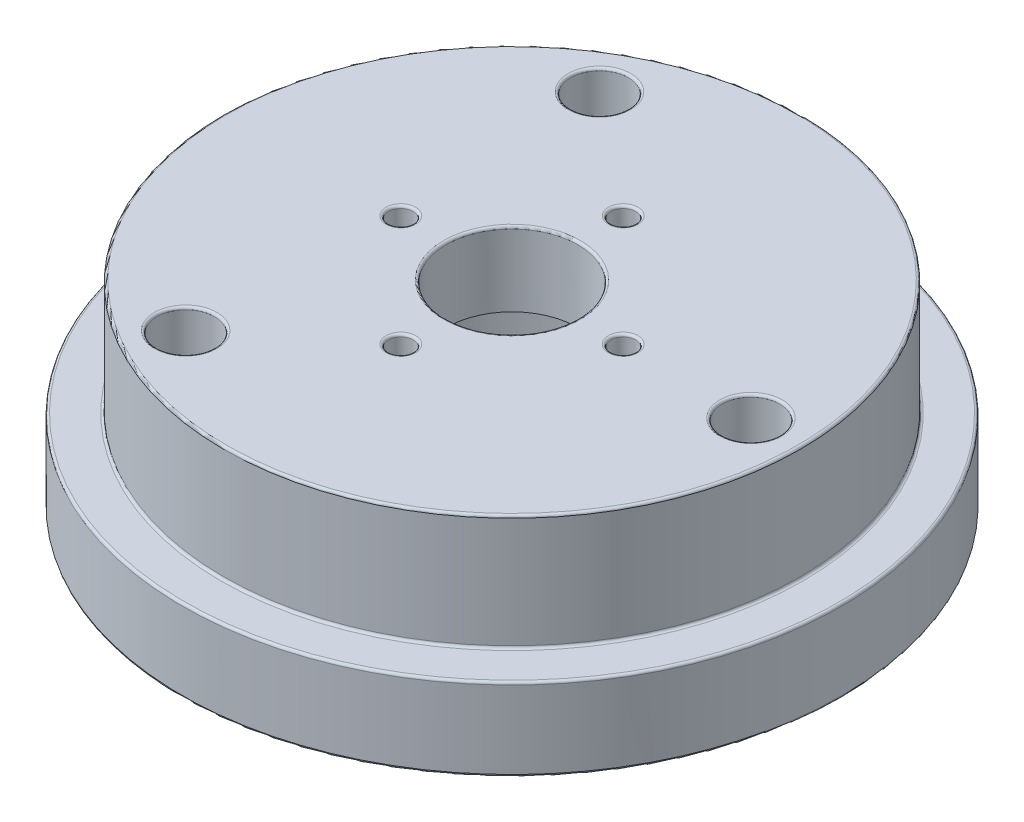
ISO-10303-21;
HEADER;
FILE_DESCRIPTION(('STEP AP214'),'2;1');
FILE_NAME('part.step','',(''),(''),'','','');
FILE_SCHEMA(('AUTOMOTIVE_DESIGN { 1 0 10303 214 1 1 1 1 }'));
ENDSEC;
DATA;
#1=APPLICATION_CONTEXT('core data for automotive mechanical design processes');
#2=APPLICATION_PROTOCOL_DEFINITION('international standard','automotive_design',2000,#1);
#3=PRODUCT_CONTEXT('',#1,'mechanical');
#4=PRODUCT('Part','Part','',(#3));
#5=PRODUCT_RELATED_PRODUCT_CATEGORY('part','',(#4));
#6=PRODUCT_DEFINITION_FORMATION('','',#4);
#7=PRODUCT_DEFINITION_CONTEXT('part definition',#1,'design');
#8=PRODUCT_DEFINITION('design','',#6,#7);
#9=PRODUCT_DEFINITION_SHAPE('','',#8);
#10=(LENGTH_UNIT() NAMED_UNIT(*) SI_UNIT(.MILLI.,.METRE.));
#11=(NAMED_UNIT(*) PLANE_ANGLE_UNIT() SI_UNIT($,.RADIAN.));
#12=(NAMED_UNIT(*) SI_UNIT($,.STERADIAN.) SOLID_ANGLE_UNIT());
#13=UNCERTAINTY_MEASURE_WITH_UNIT(LENGTH_MEASURE(1.E-05),#10,'distance_accuracy_value','');
#14=(GEOMETRIC_REPRESENTATION_CONTEXT(3) GLOBAL_UNCERTAINTY_ASSIGNED_CONTEXT((#13)) GLOBAL_UNIT_ASSIGNED_CONTEXT((#10,
#11,#12)) REPRESENTATION_CONTEXT('',''));
#15=CARTESIAN_POINT('',(0.,0.,0.));
#16=DIRECTION('',(0.,0.,1.));
#17=DIRECTION('',(1.,0.,0.));
#18=AXIS2_PLACEMENT_3D('',#15,#16,#17);
#19=CARTESIAN_POINT('',(-6.75,12.,0.));
#20=DIRECTION('',(0.,-1.,0.));
#21=DIRECTION('',(1.,0.,0.));
#22=AXIS2_PLACEMENT_3D('',#19,#20,#21);
#23=CYLINDRICAL_SURFACE('',#22,0.749999999999999);
#24=CARTESIAN_POINT('',(-6.75,11.85,0.));
#25=DIRECTION('',(0.,1.,0.));
#26=DIRECTION('',(-1.,0.,0.));
#27=AXIS2_PLACEMENT_3D('',#24,#25,#26);
#28=CIRCLE('',#27,0.749999999999999);
#29=CARTESIAN_POINT('',(-7.5,11.85,0.));
#30=VERTEX_POINT('',#29);
#31=EDGE_CURVE('E59',#30,#30,#28,.T.);
#32=ORIENTED_EDGE('',*,*,#31,.T.);
#33=EDGE_LOOP('',(#32));
#34=FACE_BOUND('',#33,.T.);
#35=CARTESIAN_POINT('',(-6.75,7.5,0.));
#36=DIRECTION('',(0.,-1.,0.));
#37=DIRECTION('',(1.,0.,0.));
#38=AXIS2_PLACEMENT_3D('',#35,#36,#37);
#39=CIRCLE('',#38,0.749999999999999);
#40=CARTESIAN_POINT('',(-6.,7.5,0.));
#41=VERTEX_POINT('',#40);
#42=EDGE_CURVE('E143',#41,#41,#39,.F.);
#43=ORIENTED_EDGE('',*,*,#42,.F.);
#44=EDGE_LOOP('',(#43));
#45=FACE_BOUND('',#44,.T.);
#46=ADVANCED_FACE('F39',(#34,#45),#23,.F.);
#47=CARTESIAN_POINT('',(0.,12.,0.));
#48=DIRECTION('',(0.,-1.,0.));
#49=DIRECTION('',(1.,0.,0.));
#50=AXIS2_PLACEMENT_3D('',#47,#48,#49);
#51=CYLINDRICAL_SURFACE('',#50,4.);
#52=CARTESIAN_POINT('',(0.,11.85,0.));
#53=DIRECTION('',(0.,1.,0.));
#54=DIRECTION('',(-1.,0.,0.));
#55=AXIS2_PLACEMENT_3D('',#52,#53,#54);
#56=CIRCLE('',#55,4.);
#57=CARTESIAN_POINT('',(-4.,11.85,0.));
#58=VERTEX_POINT('',#57);
#59=EDGE_CURVE('E54',#58,#58,#56,.T.);
#60=ORIENTED_EDGE('',*,*,#59,.T.);
#61=EDGE_LOOP('',(#60));
#62=FACE_BOUND('',#61,.T.);
#63=CARTESIAN_POINT('',(0.,7.5,0.));
#64=DIRECTION('',(0.,-1.,0.));
#65=DIRECTION('',(1.,0.,0.));
#66=AXIS2_PLACEMENT_3D('',#63,#64,#65);
#67=CIRCLE('',#66,4.);
#68=CARTESIAN_POINT('',(4.,7.5,0.));
#69=VERTEX_POINT('',#68);
#70=EDGE_CURVE('E151',#69,#69,#67,.F.);
#71=ORIENTED_EDGE('',*,*,#70,.F.);
#72=EDGE_LOOP('',(#71));
#73=FACE_BOUND('',#72,.T.);
#74=ADVANCED_FACE('F182',(#62,#73),#51,.F.);
#75=CARTESIAN_POINT('',(0.,12.,6.75));
#76=DIRECTION('',(0.,-1.,0.));
#77=DIRECTION('',(1.,0.,0.));
#78=AXIS2_PLACEMENT_3D('',#75,#76,#77);
#79=CYLINDRICAL_SURFACE('',#78,0.75);
#80=CARTESIAN_POINT('',(0.,11.85,6.75));
#81=DIRECTION('',(0.,1.,0.));
#82=DIRECTION('',(-1.,0.,0.));
#83=AXIS2_PLACEMENT_3D('',#80,#81,#82);
#84=CIRCLE('',#83,0.75);
#85=CARTESIAN_POINT('',(-0.75,11.85,6.75));
#86=VERTEX_POINT('',#85);
#87=EDGE_CURVE('E50',#86,#86,#84,.T.);
#88=ORIENTED_EDGE('',*,*,#87,.T.);
#89=EDGE_LOOP('',(#88));
#90=FACE_BOUND('',#89,.T.);
#91=CARTESIAN_POINT('',(0.,7.5,6.75));
#92=DIRECTION('',(0.,-1.,0.));
#93=DIRECTION('',(1.,0.,0.));
#94=AXIS2_PLACEMENT_3D('',#91,#92,#93);
#95=CIRCLE('',#94,0.75);
#96=CARTESIAN_POINT('',(0.75,7.5,6.75));
#97=VERTEX_POINT('',#96);
#98=EDGE_CURVE('E154',#97,#97,#95,.F.);
#99=ORIENTED_EDGE('',*,*,#98,.F.);
#100=EDGE_LOOP('',(#99));
#101=FACE_BOUND('',#100,.T.);
#102=ADVANCED_FACE('F188',(#90,#101),#79,.F.);
#103=CARTESIAN_POINT('',(0.,12.,-6.75));
#104=DIRECTION('',(0.,-1.,0.));
#105=DIRECTION('',(1.,0.,0.));
#106=AXIS2_PLACEMENT_3D('',#103,#104,#105);
#107=CYLINDRICAL_SURFACE('',#106,0.75);
#108=CARTESIAN_POINT('',(0.,11.85,-6.75));
#109=DIRECTION('',(0.,1.,0.));
#110=DIRECTION('',(-1.,0.,0.));
#111=AXIS2_PLACEMENT_3D('',#108,#109,#110);
#112=CIRCLE('',#111,0.75);
#113=CARTESIAN_POINT('',(-0.749999999999998,11.85,-6.75));
#114=VERTEX_POINT('',#113);
#115=EDGE_CURVE('E46',#114,#114,#112,.T.);
#116=ORIENTED_EDGE('',*,*,#115,.T.);
#117=EDGE_LOOP('',(#116));
#118=FACE_BOUND('',#117,.T.);
#119=CARTESIAN_POINT('',(0.,7.5,-6.75));
#120=DIRECTION('',(0.,-1.,0.));
#121=DIRECTION('',(1.,0.,0.));
#122=AXIS2_PLACEMENT_3D('',#119,#120,#121);
#123=CIRCLE('',#122,0.75);
#124=CARTESIAN_POINT('',(0.750000000000002,7.5,-6.75));
#125=VERTEX_POINT('',#124);
#126=EDGE_CURVE('E147',#125,#125,#123,.F.);
#127=ORIENTED_EDGE('',*,*,#126,.F.);
#128=EDGE_LOOP('',(#127));
#129=FACE_BOUND('',#128,.T.);
#130=ADVANCED_FACE('F296',(#118,#129),#107,.F.);
#131=CARTESIAN_POINT('',(6.75,12.,0.));
#132=DIRECTION('',(0.,-1.,0.));
#133=DIRECTION('',(1.,0.,0.));
#134=AXIS2_PLACEMENT_3D('',#131,#132,#133);
#135=CYLINDRICAL_SURFACE('',#134,0.749999999999999);
#136=CARTESIAN_POINT('',(6.75,11.85,0.));
#137=DIRECTION('',(0.,1.,0.));
#138=DIRECTION('',(-1.,0.,0.));
#139=AXIS2_PLACEMENT_3D('',#136,#137,#138);
#140=CIRCLE('',#139,0.749999999999999);
#141=CARTESIAN_POINT('',(6.,11.85,0.));
#142=VERTEX_POINT('',#141);
#143=EDGE_CURVE('E10',#142,#142,#140,.T.);
#144=ORIENTED_EDGE('',*,*,#143,.T.);
#145=EDGE_LOOP('',(#144));
#146=FACE_BOUND('',#145,.T.);
#147=CARTESIAN_POINT('',(6.75,7.5,0.));
#148=DIRECTION('',(0.,-1.,0.));
#149=DIRECTION('',(1.,0.,0.));
#150=AXIS2_PLACEMENT_3D('',#147,#148,#149);
#151=CIRCLE('',#150,0.749999999999999);
#152=CARTESIAN_POINT('',(7.5,7.5,0.));
#153=VERTEX_POINT('',#152);
#154=EDGE_CURVE('E144',#153,#153,#151,.F.);
#155=ORIENTED_EDGE('',*,*,#154,.F.);
#156=EDGE_LOOP('',(#155));
#157=FACE_BOUND('',#156,.T.);
#158=ADVANCED_FACE('F220',(#146,#157),#135,.F.);
#159=CARTESIAN_POINT('',(0.,0.,0.));
#160=DIRECTION('',(0.,-1.,0.));
#161=DIRECTION('',(1.,0.,0.));
#162=AXIS2_PLACEMENT_3D('',#159,#160,#161);
#163=PLANE('',#162);
#164=CARTESIAN_POINT('',(0.,0.,0.));
#165=DIRECTION('',(0.,-1.,0.));
#166=DIRECTION('',(1.,0.,0.));
#167=AXIS2_PLACEMENT_3D('',#164,#165,#166);
#168=CIRCLE('',#167,19.85);
#169=CARTESIAN_POINT('',(19.85,0.,0.));
#170=VERTEX_POINT('',#169);
#171=EDGE_CURVE('E122',#170,#170,#168,.T.);
#172=ORIENTED_EDGE('',*,*,#171,.T.);
#173=EDGE_LOOP('',(#172));
#174=FACE_BOUND('',#173,.T.);
#175=CARTESIAN_POINT('',(14.5,0.,0.));
#176=DIRECTION('',(0.,-1.,0.));
#177=DIRECTION('',(1.,0.,0.));
#178=AXIS2_PLACEMENT_3D('',#175,#176,#177);
#179=CIRCLE('',#178,1.9);
#180=CARTESIAN_POINT('',(16.4,0.,0.));
#181=VERTEX_POINT('',#180);
#182=EDGE_CURVE('E125',#181,#181,#179,.F.);
#183=ORIENTED_EDGE('',*,*,#182,.T.);
#184=EDGE_LOOP('',(#183));
#185=FACE_BOUND('',#184,.T.);
#186=CARTESIAN_POINT('',(-7.25000000000006,0.,-12.5573683548743));
#187=DIRECTION('',(0.,-1.,0.));
#188=DIRECTION('',(1.,0.,0.));
#189=AXIS2_PLACEMENT_3D('',#186,#187,#188);
#190=CIRCLE('',#189,1.9);
#191=CARTESIAN_POINT('',(-5.35000000000006,0.,-12.5573683548743));
#192=VERTEX_POINT('',#191);
#193=EDGE_CURVE('E128',#192,#192,#190,.F.);
#194=ORIENTED_EDGE('',*,*,#193,.T.);
#195=EDGE_LOOP('',(#194));
#196=FACE_BOUND('',#195,.T.);
#197=CARTESIAN_POINT('',(-7.24999999999988,0.,12.5573683548744));
#198=DIRECTION('',(0.,-1.,0.));
#199=DIRECTION('',(1.,0.,0.));
#200=AXIS2_PLACEMENT_3D('',#197,#198,#199);
#201=CIRCLE('',#200,1.9);
#202=CARTESIAN_POINT('',(-5.34999999999988,0.,12.5573683548744));
#203=VERTEX_POINT('',#202);
#204=EDGE_CURVE('E131',#203,#203,#201,.F.);
#205=ORIENTED_EDGE('',*,*,#204,.T.);
#206=EDGE_LOOP('',(#205));
#207=FACE_BOUND('',#206,.T.);
#208=CARTESIAN_POINT('',(0.,0.,0.));
#209=DIRECTION('',(0.,-1.,0.));
#210=DIRECTION('',(1.,0.,0.));
#211=AXIS2_PLACEMENT_3D('',#208,#209,#210);
#212=CIRCLE('',#211,10.15);
#213=CARTESIAN_POINT('',(10.15,0.,0.));
#214=VERTEX_POINT('',#213);
#215=EDGE_CURVE('E134',#214,#214,#212,.F.);
#216=ORIENTED_EDGE('',*,*,#215,.T.);
#217=EDGE_LOOP('',(#216));
#218=FACE_BOUND('',#217,.T.);
#219=ADVANCED_FACE('F217',(#174,#185,#196,#207,#218),#163,.T.);
#220=CARTESIAN_POINT('',(0.,12.,0.));
#221=DIRECTION('',(0.,1.,0.));
#222=DIRECTION('',(-1.,0.,0.));
#223=AXIS2_PLACEMENT_3D('',#220,#221,#222);
#224=CYLINDRICAL_SURFACE('',#223,20.);
#225=CARTESIAN_POINT('',(0.,0.149999999999999,0.));
#226=DIRECTION('',(0.,-1.,0.));
#227=DIRECTION('',(1.,0.,0.));
#228=AXIS2_PLACEMENT_3D('',#225,#226,#227);
#229=CIRCLE('',#228,20.);
#230=CARTESIAN_POINT('',(20.,0.149999999999999,0.));
#231=VERTEX_POINT('',#230);
#232=EDGE_CURVE('E137',#231,#231,#229,.F.);
#233=ORIENTED_EDGE('',*,*,#232,.T.);
#234=EDGE_LOOP('',(#233));
#235=FACE_BOUND('',#234,.T.);
#236=CARTESIAN_POINT('',(0.,4.85,0.));
#237=DIRECTION('',(0.,1.,0.));
#238=DIRECTION('',(-1.,0.,0.));
#239=AXIS2_PLACEMENT_3D('',#236,#237,#238);
#240=CIRCLE('',#239,20.);
#241=CARTESIAN_POINT('',(-20.,4.85,0.));
#242=VERTEX_POINT('',#241);
#243=EDGE_CURVE('E140',#242,#242,#240,.F.);
#244=ORIENTED_EDGE('',*,*,#243,.T.);
#245=EDGE_LOOP('',(#244));
#246=FACE_BOUND('',#245,.T.);
#247=ADVANCED_FACE('F213',(#235,#246),#224,.T.);
#248=CARTESIAN_POINT('',(-20.,5.,0.));
#249=DIRECTION('',(0.,1.,0.));
#250=DIRECTION('',(-1.,0.,0.));
#251=AXIS2_PLACEMENT_3D('',#248,#249,#250);
#252=PLANE('',#251);
#253=CARTESIAN_POINT('',(0.,5.,0.));
#254=DIRECTION('',(0.,1.,0.));
#255=DIRECTION('',(-1.,0.,0.));
#256=AXIS2_PLACEMENT_3D('',#253,#254,#255);
#257=CIRCLE('',#256,17.65);
#258=CARTESIAN_POINT('',(-17.65,5.,0.));
#259=VERTEX_POINT('',#258);
#260=EDGE_CURVE('E89',#259,#259,#257,.F.);
#261=ORIENTED_EDGE('',*,*,#260,.T.);
#262=EDGE_LOOP('',(#261));
#263=FACE_BOUND('',#262,.T.);
#264=CARTESIAN_POINT('',(0.,5.,0.));
#265=DIRECTION('',(0.,1.,0.));
#266=DIRECTION('',(-1.,0.,0.));
#267=AXIS2_PLACEMENT_3D('',#264,#265,#266);
#268=CIRCLE('',#267,19.85);
#269=CARTESIAN_POINT('',(-19.85,5.,0.));
#270=VERTEX_POINT('',#269);
#271=EDGE_CURVE('E92',#270,#270,#268,.T.);
#272=ORIENTED_EDGE('',*,*,#271,.T.);
#273=EDGE_LOOP('',(#272));
#274=FACE_BOUND('',#273,.T.);
#275=ADVANCED_FACE('F209',(#263,#274),#252,.T.);
#276=CARTESIAN_POINT('',(0.,12.,0.));
#277=DIRECTION('',(0.,1.,0.));
#278=DIRECTION('',(-1.,0.,0.));
#279=AXIS2_PLACEMENT_3D('',#276,#277,#278);
#280=CYLINDRICAL_SURFACE('',#279,17.5);
#281=CARTESIAN_POINT('',(0.,5.15,0.));
#282=DIRECTION('',(0.,1.,0.));
#283=DIRECTION('',(-1.,0.,0.));
#284=AXIS2_PLACEMENT_3D('',#281,#282,#283);
#285=CIRCLE('',#284,17.5);
#286=CARTESIAN_POINT('',(-17.5,5.15,0.));
#287=VERTEX_POINT('',#286);
#288=EDGE_CURVE('E95',#287,#287,#285,.T.);
#289=ORIENTED_EDGE('',*,*,#288,.T.);
#290=EDGE_LOOP('',(#289));
#291=FACE_BOUND('',#290,.T.);
#292=CARTESIAN_POINT('',(0.,11.85,0.));
#293=DIRECTION('',(0.,1.,0.));
#294=DIRECTION('',(-1.,0.,0.));
#295=AXIS2_PLACEMENT_3D('',#292,#293,#294);
#296=CIRCLE('',#295,17.5);
#297=CARTESIAN_POINT('',(-17.5,11.85,0.));
#298=VERTEX_POINT('',#297);
#299=EDGE_CURVE('E98',#298,#298,#296,.F.);
#300=ORIENTED_EDGE('',*,*,#299,.T.);
#301=EDGE_LOOP('',(#300));
#302=FACE_BOUND('',#301,.T.);
#303=ADVANCED_FACE('F205',(#291,#302),#280,.T.);
#304=CARTESIAN_POINT('',(-17.5,12.,0.));
#305=DIRECTION('',(0.,1.,0.));
#306=DIRECTION('',(-1.,0.,0.));
#307=AXIS2_PLACEMENT_3D('',#304,#305,#306);
#308=PLANE('',#307);
#309=CARTESIAN_POINT('',(0.,12.,0.));
#310=DIRECTION('',(0.,1.,0.));
#311=DIRECTION('',(-1.,0.,0.));
#312=AXIS2_PLACEMENT_3D('',#309,#310,#311);
#313=CIRCLE('',#312,17.35);
#314=CARTESIAN_POINT('',(-17.35,12.,0.));
#315=VERTEX_POINT('',#314);
#316=EDGE_CURVE('E62',#315,#315,#313,.T.);
#317=ORIENTED_EDGE('',*,*,#316,.T.);
#318=EDGE_LOOP('',(#317));
#319=FACE_BOUND('',#318,.T.);
#320=CARTESIAN_POINT('',(-6.75,12.,0.));
#321=DIRECTION('',(0.,1.,0.));
#322=DIRECTION('',(-1.,0.,0.));
#323=AXIS2_PLACEMENT_3D('',#320,#321,#322);
#324=CIRCLE('',#323,0.899999999999999);
#325=CARTESIAN_POINT('',(-7.65,12.,0.));
#326=VERTEX_POINT('',#325);
#327=EDGE_CURVE('E65',#326,#326,#324,.F.);
#328=ORIENTED_EDGE('',*,*,#327,.T.);
#329=EDGE_LOOP('',(#328));
#330=FACE_BOUND('',#329,.T.);
#331=CARTESIAN_POINT('',(0.,12.,0.));
#332=DIRECTION('',(0.,1.,0.));
#333=DIRECTION('',(-1.,0.,0.));
#334=AXIS2_PLACEMENT_3D('',#331,#332,#333);
#335=CIRCLE('',#334,4.15);
#336=CARTESIAN_POINT('',(-4.15,12.,0.));
#337=VERTEX_POINT('',#336);
#338=EDGE_CURVE('E68',#337,#337,#335,.F.);
#339=ORIENTED_EDGE('',*,*,#338,.T.);
#340=EDGE_LOOP('',(#339));
#341=FACE_BOUND('',#340,.T.);
#342=CARTESIAN_POINT('',(14.5,12.,0.));
#343=DIRECTION('',(0.,1.,0.));
#344=DIRECTION('',(-1.,0.,0.));
#345=AXIS2_PLACEMENT_3D('',#342,#343,#344);
#346=CIRCLE('',#345,1.9);
#347=CARTESIAN_POINT('',(12.6,12.,0.));
#348=VERTEX_POINT('',#347);
#349=EDGE_CURVE('E71',#348,#348,#346,.F.);
#350=ORIENTED_EDGE('',*,*,#349,.T.);
#351=EDGE_LOOP('',(#350));
#352=FACE_BOUND('',#351,.T.);
#353=CARTESIAN_POINT('',(-7.25000000000006,12.,-12.5573683548743));
#354=DIRECTION('',(0.,1.,0.));
#355=DIRECTION('',(-1.,0.,0.));
#356=AXIS2_PLACEMENT_3D('',#353,#354,#355);
#357=CIRCLE('',#356,1.9);
#358=CARTESIAN_POINT('',(-9.15000000000006,12.,-12.5573683548743));
#359=VERTEX_POINT('',#358);
#360=EDGE_CURVE('E74',#359,#359,#357,.F.);
#361=ORIENTED_EDGE('',*,*,#360,.T.);
#362=EDGE_LOOP('',(#361));
#363=FACE_BOUND('',#362,.T.);
#364=CARTESIAN_POINT('',(0.,12.,6.75));
#365=DIRECTION('',(0.,1.,0.));
#366=DIRECTION('',(-1.,0.,0.));
#367=AXIS2_PLACEMENT_3D('',#364,#365,#366);
#368=CIRCLE('',#367,0.9);
#369=CARTESIAN_POINT('',(-0.9,12.,6.75));
#370=VERTEX_POINT('',#369);
#371=EDGE_CURVE('E77',#370,#370,#368,.F.);
#372=ORIENTED_EDGE('',*,*,#371,.T.);
#373=EDGE_LOOP('',(#372));
#374=FACE_BOUND('',#373,.T.);
#375=CARTESIAN_POINT('',(0.,12.,-6.75));
#376=DIRECTION('',(0.,1.,0.));
#377=DIRECTION('',(-1.,0.,0.));
#378=AXIS2_PLACEMENT_3D('',#375,#376,#377);
#379=CIRCLE('',#378,0.9);
#380=CARTESIAN_POINT('',(-0.899999999999998,12.,-6.75));
#381=VERTEX_POINT('',#380);
#382=EDGE_CURVE('E80',#381,#381,#379,.F.);
#383=ORIENTED_EDGE('',*,*,#382,.T.);
#384=EDGE_LOOP('',(#383));
#385=FACE_BOUND('',#384,.T.);
#386=CARTESIAN_POINT('',(6.75,12.,0.));
#387=DIRECTION('',(0.,1.,0.));
#388=DIRECTION('',(-1.,0.,0.));
#389=AXIS2_PLACEMENT_3D('',#386,#387,#388);
#390=CIRCLE('',#389,0.899999999999999);
#391=CARTESIAN_POINT('',(5.85,12.,0.));
#392=VERTEX_POINT('',#391);
#393=EDGE_CURVE('E83',#392,#392,#390,.F.);
#394=ORIENTED_EDGE('',*,*,#393,.T.);
#395=EDGE_LOOP('',(#394));
#396=FACE_BOUND('',#395,.T.);
#397=CARTESIAN_POINT('',(-7.24999999999988,12.,12.5573683548744));
#398=DIRECTION('',(0.,1.,0.));
#399=DIRECTION('',(-1.,0.,0.));
#400=AXIS2_PLACEMENT_3D('',#397,#398,#399);
#401=CIRCLE('',#400,1.9);
#402=CARTESIAN_POINT('',(-9.14999999999988,12.,12.5573683548744));
#403=VERTEX_POINT('',#402);
#404=EDGE_CURVE('E86',#403,#403,#401,.F.);
#405=ORIENTED_EDGE('',*,*,#404,.T.);
#406=EDGE_LOOP('',(#405));
#407=FACE_BOUND('',#406,.T.);
#408=ADVANCED_FACE('F201',(#319,#330,#341,#352,#363,#374,#385,#396,#407),#308,.T.);
#409=CARTESIAN_POINT('',(14.5,12.,0.));
#410=DIRECTION('',(0.,-1.,0.));
#411=DIRECTION('',(1.,0.,0.));
#412=AXIS2_PLACEMENT_3D('',#409,#410,#411);
#413=CYLINDRICAL_SURFACE('',#412,1.75);
#414=CARTESIAN_POINT('',(14.5,0.149999999999999,0.));
#415=DIRECTION('',(0.,-1.,0.));
#416=DIRECTION('',(1.,0.,0.));
#417=AXIS2_PLACEMENT_3D('',#414,#415,#416);
#418=CIRCLE('',#417,1.75);
#419=CARTESIAN_POINT('',(16.25,0.149999999999999,0.));
#420=VERTEX_POINT('',#419);
#421=EDGE_CURVE('E116',#420,#420,#418,.T.);
#422=ORIENTED_EDGE('',*,*,#421,.T.);
#423=EDGE_LOOP('',(#422));
#424=FACE_BOUND('',#423,.T.);
#425=CARTESIAN_POINT('',(14.5,11.85,0.));
#426=DIRECTION('',(0.,1.,0.));
#427=DIRECTION('',(-1.,0.,0.));
#428=AXIS2_PLACEMENT_3D('',#425,#426,#427);
#429=CIRCLE('',#428,1.75);
#430=CARTESIAN_POINT('',(12.75,11.85,0.));
#431=VERTEX_POINT('',#430);
#432=EDGE_CURVE('E119',#431,#431,#429,.T.);
#433=ORIENTED_EDGE('',*,*,#432,.T.);
#434=EDGE_LOOP('',(#433));
#435=FACE_BOUND('',#434,.T.);
#436=ADVANCED_FACE('F197',(#424,#435),#413,.F.);
#437=CARTESIAN_POINT('',(-7.25000000000006,12.,-12.5573683548743));
#438=DIRECTION('',(0.,-1.,0.));
#439=DIRECTION('',(1.,0.,0.));
#440=AXIS2_PLACEMENT_3D('',#437,#438,#439);
#441=CYLINDRICAL_SURFACE('',#440,1.75);
#442=CARTESIAN_POINT('',(-7.25000000000006,0.149999999999999,-12.5573683548743));
#443=DIRECTION('',(0.,-1.,0.));
#444=DIRECTION('',(1.,0.,0.));
#445=AXIS2_PLACEMENT_3D('',#442,#443,#444);
#446=CIRCLE('',#445,1.75);
#447=CARTESIAN_POINT('',(-5.50000000000006,0.149999999999999,-12.5573683548743));
#448=VERTEX_POINT('',#447);
#449=EDGE_CURVE('E110',#448,#448,#446,.T.);
#450=ORIENTED_EDGE('',*,*,#449,.T.);
#451=EDGE_LOOP('',(#450));
#452=FACE_BOUND('',#451,.T.);
#453=CARTESIAN_POINT('',(-7.25000000000006,11.85,-12.5573683548743));
#454=DIRECTION('',(0.,1.,0.));
#455=DIRECTION('',(-1.,0.,0.));
#456=AXIS2_PLACEMENT_3D('',#453,#454,#455);
#457=CIRCLE('',#456,1.75);
#458=CARTESIAN_POINT('',(-9.00000000000006,11.85,-12.5573683548743));
#459=VERTEX_POINT('',#458);
#460=EDGE_CURVE('E113',#459,#459,#457,.T.);
#461=ORIENTED_EDGE('',*,*,#460,.T.);
#462=EDGE_LOOP('',(#461));
#463=FACE_BOUND('',#462,.T.);
#464=ADVANCED_FACE('F194',(#452,#463),#441,.F.);
#465=CARTESIAN_POINT('',(-7.24999999999988,12.,12.5573683548744));
#466=DIRECTION('',(0.,-1.,0.));
#467=DIRECTION('',(1.,0.,0.));
#468=AXIS2_PLACEMENT_3D('',#465,#466,#467);
#469=CYLINDRICAL_SURFACE('',#468,1.75);
#470=CARTESIAN_POINT('',(-7.24999999999988,0.149999999999999,12.5573683548744));
#471=DIRECTION('',(0.,-1.,0.));
#472=DIRECTION('',(1.,0.,0.));
#473=AXIS2_PLACEMENT_3D('',#470,#471,#472);
#474=CIRCLE('',#473,1.75);
#475=CARTESIAN_POINT('',(-5.49999999999988,0.149999999999999,12.5573683548744));
#476=VERTEX_POINT('',#475);
#477=EDGE_CURVE('E104',#476,#476,#474,.T.);
#478=ORIENTED_EDGE('',*,*,#477,.T.);
#479=EDGE_LOOP('',(#478));
#480=FACE_BOUND('',#479,.T.);
#481=CARTESIAN_POINT('',(-7.24999999999988,11.85,12.5573683548744));
#482=DIRECTION('',(0.,1.,0.));
#483=DIRECTION('',(-1.,0.,0.));
#484=AXIS2_PLACEMENT_3D('',#481,#482,#483);
#485=CIRCLE('',#484,1.75);
#486=CARTESIAN_POINT('',(-8.99999999999988,11.85,12.5573683548744));
#487=VERTEX_POINT('',#486);
#488=EDGE_CURVE('E107',#487,#487,#485,.T.);
#489=ORIENTED_EDGE('',*,*,#488,.T.);
#490=EDGE_LOOP('',(#489));
#491=FACE_BOUND('',#490,.T.);
#492=ADVANCED_FACE('F178',(#480,#491),#469,.F.);
#493=CARTESIAN_POINT('',(0.,7.5,0.));
#494=DIRECTION('',(0.,-1.,0.));
#495=DIRECTION('',(1.,0.,0.));
#496=AXIS2_PLACEMENT_3D('',#493,#494,#495);
#497=PLANE('',#496);
#498=CARTESIAN_POINT('',(0.,7.5,0.));
#499=DIRECTION('',(0.,-1.,0.));
#500=DIRECTION('',(1.,0.,0.));
#501=AXIS2_PLACEMENT_3D('',#498,#499,#500);
#502=CIRCLE('',#501,10.);
#503=CARTESIAN_POINT('',(10.,7.5,0.));
#504=VERTEX_POINT('',#503);
#505=EDGE_CURVE('E148',#504,#504,#502,.T.);
#506=ORIENTED_EDGE('',*,*,#505,.T.);
#507=EDGE_LOOP('',(#506));
#508=FACE_BOUND('',#507,.T.);
#509=ORIENTED_EDGE('',*,*,#154,.T.);
#510=EDGE_LOOP('',(#509));
#511=FACE_BOUND('',#510,.T.);
#512=ORIENTED_EDGE('',*,*,#126,.T.);
#513=EDGE_LOOP('',(#512));
#514=FACE_BOUND('',#513,.T.);
#515=ORIENTED_EDGE('',*,*,#98,.T.);
#516=EDGE_LOOP('',(#515));
#517=FACE_BOUND('',#516,.T.);
#518=ORIENTED_EDGE('',*,*,#70,.T.);
#519=EDGE_LOOP('',(#518));
#520=FACE_BOUND('',#519,.T.);
#521=ORIENTED_EDGE('',*,*,#42,.T.);
#522=EDGE_LOOP('',(#521));
#523=FACE_BOUND('',#522,.T.);
#524=ADVANCED_FACE('F162',(#508,#511,#514,#517,#520,#523),#497,.T.);
#525=CARTESIAN_POINT('',(0.,7.5,0.));
#526=DIRECTION('',(0.,-1.,0.));
#527=DIRECTION('',(1.,0.,0.));
#528=AXIS2_PLACEMENT_3D('',#525,#526,#527);
#529=CYLINDRICAL_SURFACE('',#528,10.);
#530=CARTESIAN_POINT('',(0.,0.15,0.));
#531=DIRECTION('',(0.,-1.,0.));
#532=DIRECTION('',(1.,0.,0.));
#533=AXIS2_PLACEMENT_3D('',#530,#531,#532);
#534=CIRCLE('',#533,10.);
#535=CARTESIAN_POINT('',(10.,0.15,0.));
#536=VERTEX_POINT('',#535);
#537=EDGE_CURVE('E101',#536,#536,#534,.T.);
#538=ORIENTED_EDGE('',*,*,#537,.T.);
#539=EDGE_LOOP('',(#538));
#540=FACE_BOUND('',#539,.T.);
#541=ORIENTED_EDGE('',*,*,#505,.F.);
#542=EDGE_LOOP('',(#541));
#543=FACE_BOUND('',#542,.T.);
#544=ADVANCED_FACE('F165',(#540,#543),#529,.F.);
#545=CARTESIAN_POINT('',(0.,0.149999999999999,0.));
#546=DIRECTION('',(0.,-1.,0.));
#547=DIRECTION('',(1.,0.,0.));
#548=AXIS2_PLACEMENT_3D('',#545,#546,#547);
#549=TOROIDAL_SURFACE('',#548,19.85,0.15);
#550=ORIENTED_EDGE('',*,*,#171,.F.);
#551=EDGE_LOOP('',(#550));
#552=FACE_BOUND('',#551,.T.);
#553=ORIENTED_EDGE('',*,*,#232,.F.);
#554=EDGE_LOOP('',(#553));
#555=FACE_BOUND('',#554,.T.);
#556=ADVANCED_FACE('F167',(#552,#555),#549,.T.);
#557=CARTESIAN_POINT('',(14.5,0.149999999999999,0.));
#558=DIRECTION('',(0.,-1.,0.));
#559=DIRECTION('',(1.,0.,0.));
#560=AXIS2_PLACEMENT_3D('',#557,#558,#559);
#561=TOROIDAL_SURFACE('',#560,1.9,0.15);
#562=ORIENTED_EDGE('',*,*,#182,.F.);
#563=EDGE_LOOP('',(#562));
#564=FACE_BOUND('',#563,.T.);
#565=ORIENTED_EDGE('',*,*,#421,.F.);
#566=EDGE_LOOP('',(#565));
#567=FACE_BOUND('',#566,.T.);
#568=ADVANCED_FACE('F174',(#564,#567),#561,.T.);
#569=CARTESIAN_POINT('',(-7.25000000000006,0.149999999999999,-12.5573683548743));
#570=DIRECTION('',(0.,-1.,0.));
#571=DIRECTION('',(1.,0.,0.));
#572=AXIS2_PLACEMENT_3D('',#569,#570,#571);
#573=TOROIDAL_SURFACE('',#572,1.9,0.15);
#574=ORIENTED_EDGE('',*,*,#193,.F.);
#575=EDGE_LOOP('',(#574));
#576=FACE_BOUND('',#575,.T.);
#577=ORIENTED_EDGE('',*,*,#449,.F.);
#578=EDGE_LOOP('',(#577));
#579=FACE_BOUND('',#578,.T.);
#580=ADVANCED_FACE('F225',(#576,#579),#573,.T.);
#581=CARTESIAN_POINT('',(-7.24999999999988,0.149999999999999,12.5573683548744));
#582=DIRECTION('',(0.,-1.,0.));
#583=DIRECTION('',(1.,0.,0.));
#584=AXIS2_PLACEMENT_3D('',#581,#582,#583);
#585=TOROIDAL_SURFACE('',#584,1.9,0.15);
#586=ORIENTED_EDGE('',*,*,#204,.F.);
#587=EDGE_LOOP('',(#586));
#588=FACE_BOUND('',#587,.T.);
#589=ORIENTED_EDGE('',*,*,#477,.F.);
#590=EDGE_LOOP('',(#589));
#591=FACE_BOUND('',#590,.T.);
#592=ADVANCED_FACE('F229',(#588,#591),#585,.T.);
#593=CARTESIAN_POINT('',(0.,0.15,0.));
#594=DIRECTION('',(0.,-1.,0.));
#595=DIRECTION('',(1.,0.,0.));
#596=AXIS2_PLACEMENT_3D('',#593,#594,#595);
#597=TOROIDAL_SURFACE('',#596,10.15,0.15);
#598=ORIENTED_EDGE('',*,*,#215,.F.);
#599=EDGE_LOOP('',(#598));
#600=FACE_BOUND('',#599,.T.);
#601=ORIENTED_EDGE('',*,*,#537,.F.);
#602=EDGE_LOOP('',(#601));
#603=FACE_BOUND('',#602,.T.);
#604=ADVANCED_FACE('F233',(#600,#603),#597,.T.);
#605=CARTESIAN_POINT('',(0.,5.15,0.));
#606=DIRECTION('',(0.,1.,0.));
#607=DIRECTION('',(-1.,0.,0.));
#608=AXIS2_PLACEMENT_3D('',#605,#606,#607);
#609=TOROIDAL_SURFACE('',#608,17.65,0.15);
#610=ORIENTED_EDGE('',*,*,#260,.F.);
#611=EDGE_LOOP('',(#610));
#612=FACE_BOUND('',#611,.T.);
#613=ORIENTED_EDGE('',*,*,#288,.F.);
#614=EDGE_LOOP('',(#613));
#615=FACE_BOUND('',#614,.T.);
#616=ADVANCED_FACE('F237',(#612,#615),#609,.F.);
#617=CARTESIAN_POINT('',(0.,4.85,0.));
#618=DIRECTION('',(0.,1.,0.));
#619=DIRECTION('',(-1.,0.,0.));
#620=AXIS2_PLACEMENT_3D('',#617,#618,#619);
#621=TOROIDAL_SURFACE('',#620,19.85,0.15);
#622=ORIENTED_EDGE('',*,*,#243,.F.);
#623=EDGE_LOOP('',(#622));
#624=FACE_BOUND('',#623,.T.);
#625=ORIENTED_EDGE('',*,*,#271,.F.);
#626=EDGE_LOOP('',(#625));
#627=FACE_BOUND('',#626,.T.);
#628=ADVANCED_FACE('F241',(#624,#627),#621,.T.);
#629=CARTESIAN_POINT('',(0.,11.85,0.));
#630=DIRECTION('',(0.,1.,0.));
#631=DIRECTION('',(-1.,0.,0.));
#632=AXIS2_PLACEMENT_3D('',#629,#630,#631);
#633=TOROIDAL_SURFACE('',#632,17.35,0.15);
#634=ORIENTED_EDGE('',*,*,#299,.F.);
#635=EDGE_LOOP('',(#634));
#636=FACE_BOUND('',#635,.T.);
#637=ORIENTED_EDGE('',*,*,#316,.F.);
#638=EDGE_LOOP('',(#637));
#639=FACE_BOUND('',#638,.T.);
#640=ADVANCED_FACE('F245',(#636,#639),#633,.T.);
#641=CARTESIAN_POINT('',(-6.75,11.85,0.));
#642=DIRECTION('',(0.,1.,0.));
#643=DIRECTION('',(-1.,0.,0.));
#644=AXIS2_PLACEMENT_3D('',#641,#642,#643);
#645=TOROIDAL_SURFACE('',#644,0.899999999999999,0.15);
#646=ORIENTED_EDGE('',*,*,#31,.F.);
#647=EDGE_LOOP('',(#646));
#648=FACE_BOUND('',#647,.T.);
#649=ORIENTED_EDGE('',*,*,#327,.F.);
#650=EDGE_LOOP('',(#649));
#651=FACE_BOUND('',#650,.T.);
#652=ADVANCED_FACE('F249',(#648,#651),#645,.T.);
#653=CARTESIAN_POINT('',(0.,11.85,0.));
#654=DIRECTION('',(0.,1.,0.));
#655=DIRECTION('',(-1.,0.,0.));
#656=AXIS2_PLACEMENT_3D('',#653,#654,#655);
#657=TOROIDAL_SURFACE('',#656,4.15,0.15);
#658=ORIENTED_EDGE('',*,*,#59,.F.);
#659=EDGE_LOOP('',(#658));
#660=FACE_BOUND('',#659,.T.);
#661=ORIENTED_EDGE('',*,*,#338,.F.);
#662=EDGE_LOOP('',(#661));
#663=FACE_BOUND('',#662,.T.);
#664=ADVANCED_FACE('F253',(#660,#663),#657,.T.);
#665=CARTESIAN_POINT('',(14.5,11.85,0.));
#666=DIRECTION('',(0.,1.,0.));
#667=DIRECTION('',(-1.,0.,0.));
#668=AXIS2_PLACEMENT_3D('',#665,#666,#667);
#669=TOROIDAL_SURFACE('',#668,1.9,0.15);
#670=ORIENTED_EDGE('',*,*,#432,.F.);
#671=EDGE_LOOP('',(#670));
#672=FACE_BOUND('',#671,.T.);
#673=ORIENTED_EDGE('',*,*,#349,.F.);
#674=EDGE_LOOP('',(#673));
#675=FACE_BOUND('',#674,.T.);
#676=ADVANCED_FACE('F257',(#672,#675),#669,.T.);
#677=CARTESIAN_POINT('',(-7.25000000000006,11.85,-12.5573683548743));
#678=DIRECTION('',(0.,1.,0.));
#679=DIRECTION('',(-1.,0.,0.));
#680=AXIS2_PLACEMENT_3D('',#677,#678,#679);
#681=TOROIDAL_SURFACE('',#680,1.9,0.15);
#682=ORIENTED_EDGE('',*,*,#460,.F.);
#683=EDGE_LOOP('',(#682));
#684=FACE_BOUND('',#683,.T.);
#685=ORIENTED_EDGE('',*,*,#360,.F.);
#686=EDGE_LOOP('',(#685));
#687=FACE_BOUND('',#686,.T.);
#688=ADVANCED_FACE('F261',(#684,#687),#681,.T.);
#689=CARTESIAN_POINT('',(0.,11.85,6.75));
#690=DIRECTION('',(0.,1.,0.));
#691=DIRECTION('',(-1.,0.,0.));
#692=AXIS2_PLACEMENT_3D('',#689,#690,#691);
#693=TOROIDAL_SURFACE('',#692,0.9,0.15);
#694=ORIENTED_EDGE('',*,*,#87,.F.);
#695=EDGE_LOOP('',(#694));
#696=FACE_BOUND('',#695,.T.);
#697=ORIENTED_EDGE('',*,*,#371,.F.);
#698=EDGE_LOOP('',(#697));
#699=FACE_BOUND('',#698,.T.);
#700=ADVANCED_FACE('F265',(#696,#699),#693,.T.);
#701=CARTESIAN_POINT('',(0.,11.85,-6.75));
#702=DIRECTION('',(0.,1.,0.));
#703=DIRECTION('',(-1.,0.,0.));
#704=AXIS2_PLACEMENT_3D('',#701,#702,#703);
#705=TOROIDAL_SURFACE('',#704,0.9,0.15);
#706=ORIENTED_EDGE('',*,*,#115,.F.);
#707=EDGE_LOOP('',(#706));
#708=FACE_BOUND('',#707,.T.);
#709=ORIENTED_EDGE('',*,*,#382,.F.);
#710=EDGE_LOOP('',(#709));
#711=FACE_BOUND('',#710,.T.);
#712=ADVANCED_FACE('F269',(#708,#711),#705,.T.);
#713=CARTESIAN_POINT('',(6.75,11.85,0.));
#714=DIRECTION('',(0.,1.,0.));
#715=DIRECTION('',(-1.,0.,0.));
#716=AXIS2_PLACEMENT_3D('',#713,#714,#715);
#717=TOROIDAL_SURFACE('',#716,0.899999999999999,0.15);
#718=ORIENTED_EDGE('',*,*,#143,.F.);
#719=EDGE_LOOP('',(#718));
#720=FACE_BOUND('',#719,.T.);
#721=ORIENTED_EDGE('',*,*,#393,.F.);
#722=EDGE_LOOP('',(#721));
#723=FACE_BOUND('',#722,.T.);
#724=ADVANCED_FACE('F272',(#720,#723),#717,.T.);
#725=CARTESIAN_POINT('',(-7.24999999999988,11.85,12.5573683548744));
#726=DIRECTION('',(0.,1.,0.));
#727=DIRECTION('',(-1.,0.,0.));
#728=AXIS2_PLACEMENT_3D('',#725,#726,#727);
#729=TOROIDAL_SURFACE('',#728,1.9,0.15);
#730=ORIENTED_EDGE('',*,*,#488,.F.);
#731=EDGE_LOOP('',(#730));
#732=FACE_BOUND('',#731,.T.);
#733=ORIENTED_EDGE('',*,*,#404,.F.);
#734=EDGE_LOOP('',(#733));
#735=FACE_BOUND('',#734,.T.);
#736=ADVANCED_FACE('F41',(#732,#735),#729,.T.);
#737=CLOSED_SHELL('',(#46,#74,#102,#130,#158,#219,#247,#275,#303,#408,#436,#464,#492,#524,#544,
#556,#568,#580,#592,#604,#616,#628,#640,#652,#664,#676,#688,#700,#712,#724,#736));
#738=MANIFOLD_SOLID_BREP('B2',#737);
#739=ADVANCED_BREP_SHAPE_REPRESENTATION('',(#18,#738),#14);
#740=SHAPE_DEFINITION_REPRESENTATION(#9,#739);
ENDSEC;
END-ISO-10303-21;
